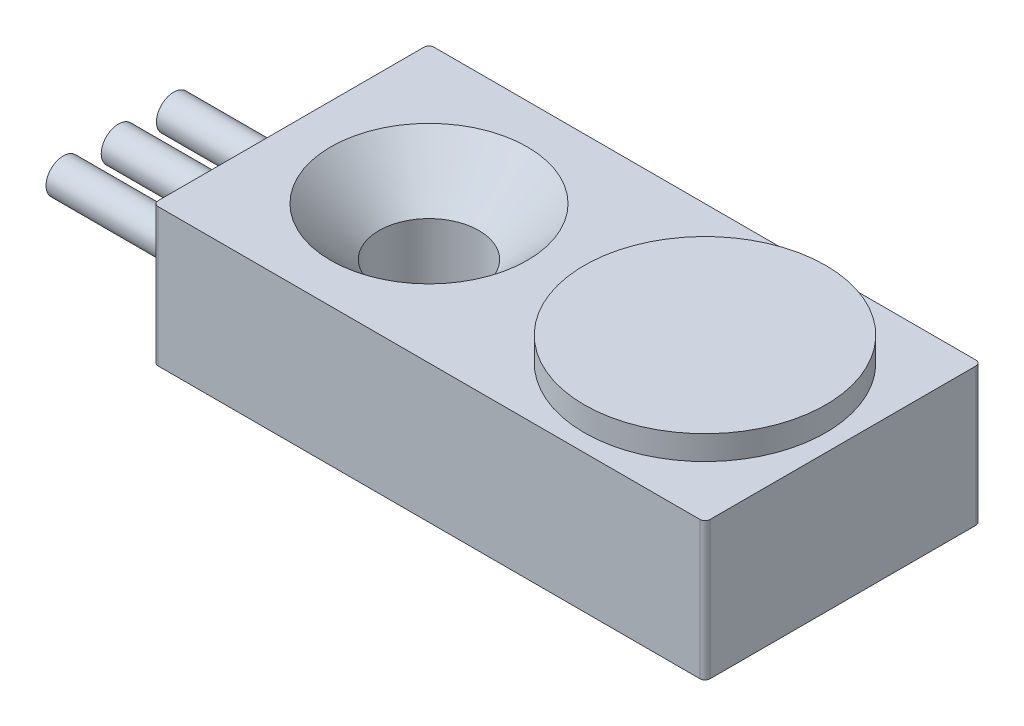
ISO-10303-21;
HEADER;
FILE_DESCRIPTION(('STEP AP214'),'2;1');
FILE_NAME('part.step','',(''),(''),'','','');
FILE_SCHEMA(('AUTOMOTIVE_DESIGN { 1 0 10303 214 1 1 1 1 }'));
ENDSEC;
DATA;
#1=APPLICATION_CONTEXT('core data for automotive mechanical design processes');
#2=APPLICATION_PROTOCOL_DEFINITION('international standard','automotive_design',2000,#1);
#3=PRODUCT_CONTEXT('',#1,'mechanical');
#4=PRODUCT('Part','Part','',(#3));
#5=PRODUCT_RELATED_PRODUCT_CATEGORY('part','',(#4));
#6=PRODUCT_DEFINITION_FORMATION('','',#4);
#7=PRODUCT_DEFINITION_CONTEXT('part definition',#1,'design');
#8=PRODUCT_DEFINITION('design','',#6,#7);
#9=PRODUCT_DEFINITION_SHAPE('','',#8);
#10=(LENGTH_UNIT() NAMED_UNIT(*) SI_UNIT(.MILLI.,.METRE.));
#11=(NAMED_UNIT(*) PLANE_ANGLE_UNIT() SI_UNIT($,.RADIAN.));
#12=(NAMED_UNIT(*) SI_UNIT($,.STERADIAN.) SOLID_ANGLE_UNIT());
#13=UNCERTAINTY_MEASURE_WITH_UNIT(LENGTH_MEASURE(1.E-05),#10,'distance_accuracy_value','');
#14=(GEOMETRIC_REPRESENTATION_CONTEXT(3) GLOBAL_UNCERTAINTY_ASSIGNED_CONTEXT((#13)) GLOBAL_UNIT_ASSIGNED_CONTEXT((#10,
#11,#12)) REPRESENTATION_CONTEXT('',''));
#15=CARTESIAN_POINT('',(0.,0.,0.));
#16=DIRECTION('',(0.,0.,1.));
#17=DIRECTION('',(1.,0.,0.));
#18=AXIS2_PLACEMENT_3D('',#15,#16,#17);
#19=CARTESIAN_POINT('',(0.,4.7,0.));
#20=DIRECTION('',(0.,1.,0.));
#21=DIRECTION('',(0.,0.,1.));
#22=AXIS2_PLACEMENT_3D('',#19,#20,#21);
#23=PLANE('',#22);
#24=CARTESIAN_POINT('',(0.,4.7,0.));
#25=DIRECTION('',(0.,1.,0.));
#26=DIRECTION('',(0.,0.,1.));
#27=AXIS2_PLACEMENT_3D('',#24,#25,#26);
#28=CIRCLE('',#27,3.5);
#29=CARTESIAN_POINT('',(0.,4.7,3.5));
#30=VERTEX_POINT('',#29);
#31=EDGE_CURVE('E18',#30,#30,#28,.F.);
#32=ORIENTED_EDGE('',*,*,#31,.F.);
#33=EDGE_LOOP('',(#32));
#34=FACE_BOUND('',#33,.T.);
#35=ADVANCED_FACE('F15',(#34),#23,.T.);
#36=CARTESIAN_POINT('',(-17.,0.,0.));
#37=DIRECTION('',(-1.,0.,0.));
#38=DIRECTION('',(0.,0.,1.));
#39=AXIS2_PLACEMENT_3D('',#36,#37,#38);
#40=PLANE('',#39);
#41=CARTESIAN_POINT('',(-17.,1.,0.));
#42=DIRECTION('',(-1.,0.,0.));
#43=DIRECTION('',(0.,0.,1.));
#44=AXIS2_PLACEMENT_3D('',#41,#42,#43);
#45=CIRCLE('',#44,0.5);
#46=CARTESIAN_POINT('',(-17.,1.,0.5));
#47=VERTEX_POINT('',#46);
#48=EDGE_CURVE('E157',#47,#47,#45,.F.);
#49=ORIENTED_EDGE('',*,*,#48,.F.);
#50=EDGE_LOOP('',(#49));
#51=FACE_BOUND('',#50,.T.);
#52=ADVANCED_FACE('F169',(#51),#40,.T.);
#53=CARTESIAN_POINT('',(-17.,0.,0.));
#54=DIRECTION('',(-1.,0.,0.));
#55=DIRECTION('',(0.,0.,1.));
#56=AXIS2_PLACEMENT_3D('',#53,#54,#55);
#57=PLANE('',#56);
#58=CARTESIAN_POINT('',(-17.,1.,1.6));
#59=DIRECTION('',(-1.,0.,0.));
#60=DIRECTION('',(0.,0.,1.));
#61=AXIS2_PLACEMENT_3D('',#58,#59,#60);
#62=CIRCLE('',#61,0.5);
#63=CARTESIAN_POINT('',(-17.,1.,2.1));
#64=VERTEX_POINT('',#63);
#65=EDGE_CURVE('E154',#64,#64,#62,.F.);
#66=ORIENTED_EDGE('',*,*,#65,.F.);
#67=EDGE_LOOP('',(#66));
#68=FACE_BOUND('',#67,.T.);
#69=ADVANCED_FACE('F174',(#68),#57,.T.);
#70=CARTESIAN_POINT('',(-17.,0.,0.));
#71=DIRECTION('',(-1.,0.,0.));
#72=DIRECTION('',(0.,0.,1.));
#73=AXIS2_PLACEMENT_3D('',#70,#71,#72);
#74=PLANE('',#73);
#75=CARTESIAN_POINT('',(-17.,1.,-1.6));
#76=DIRECTION('',(-1.,0.,0.));
#77=DIRECTION('',(0.,0.,1.));
#78=AXIS2_PLACEMENT_3D('',#75,#76,#77);
#79=CIRCLE('',#78,0.5);
#80=CARTESIAN_POINT('',(-17.,1.,-1.1));
#81=VERTEX_POINT('',#80);
#82=EDGE_CURVE('E151',#81,#81,#79,.F.);
#83=ORIENTED_EDGE('',*,*,#82,.F.);
#84=EDGE_LOOP('',(#83));
#85=FACE_BOUND('',#84,.T.);
#86=ADVANCED_FACE('F235',(#85),#74,.T.);
#87=CARTESIAN_POINT('',(0.,4.7,0.));
#88=DIRECTION('',(0.,1.,0.));
#89=DIRECTION('',(0.,0.,1.));
#90=AXIS2_PLACEMENT_3D('',#87,#88,#89);
#91=CYLINDRICAL_SURFACE('',#90,3.5);
#92=ORIENTED_EDGE('',*,*,#31,.T.);
#93=EDGE_LOOP('',(#92));
#94=FACE_BOUND('',#93,.T.);
#95=CARTESIAN_POINT('',(0.,4.,0.));
#96=DIRECTION('',(0.,1.,0.));
#97=DIRECTION('',(0.,0.,1.));
#98=AXIS2_PLACEMENT_3D('',#95,#96,#97);
#99=CIRCLE('',#98,3.5);
#100=CARTESIAN_POINT('',(0.,4.,3.5));
#101=VERTEX_POINT('',#100);
#102=EDGE_CURVE('E142',#101,#101,#99,.F.);
#103=ORIENTED_EDGE('',*,*,#102,.F.);
#104=EDGE_LOOP('',(#103));
#105=FACE_BOUND('',#104,.T.);
#106=ADVANCED_FACE('F165',(#94,#105),#91,.T.);
#107=CARTESIAN_POINT('',(-11.85,4.035923931014,-3.85));
#108=DIRECTION('',(0.,-1.,0.));
#109=DIRECTION('',(0.,0.,-1.));
#110=AXIS2_PLACEMENT_3D('',#107,#108,#109);
#111=CYLINDRICAL_SURFACE('',#110,0.15);
#112=DIRECTION('',(0.,1.,0.));
#113=VECTOR('',#112,1.);
#114=CARTESIAN_POINT('',(-11.85,0.,-4.));
#115=LINE('',#114,#113);
#116=CARTESIAN_POINT('',(-11.85,0.,-4.));
#117=VERTEX_POINT('',#116);
#118=CARTESIAN_POINT('',(-11.85,4.,-4.));
#119=VERTEX_POINT('',#118);
#120=EDGE_CURVE('E125',#117,#119,#115,.T.);
#121=ORIENTED_EDGE('',*,*,#120,.F.);
#122=CARTESIAN_POINT('',(-11.85,0.,-3.85));
#123=DIRECTION('',(0.,-1.,0.));
#124=DIRECTION('',(0.,0.,-1.));
#125=AXIS2_PLACEMENT_3D('',#122,#123,#124);
#126=CIRCLE('',#125,0.15);
#127=CARTESIAN_POINT('',(-12.,0.,-3.85));
#128=VERTEX_POINT('',#127);
#129=EDGE_CURVE('E71',#117,#128,#126,.F.);
#130=ORIENTED_EDGE('',*,*,#129,.T.);
#131=DIRECTION('',(0.,1.,0.));
#132=VECTOR('',#131,1.);
#133=CARTESIAN_POINT('',(-12.,0.,-3.85));
#134=LINE('',#133,#132);
#135=CARTESIAN_POINT('',(-12.,4.,-3.85));
#136=VERTEX_POINT('',#135);
#137=EDGE_CURVE('E122',#136,#128,#134,.F.);
#138=ORIENTED_EDGE('',*,*,#137,.F.);
#139=CARTESIAN_POINT('',(-11.85,4.,-3.85));
#140=DIRECTION('',(0.,-1.,0.));
#141=DIRECTION('',(0.,0.,-1.));
#142=AXIS2_PLACEMENT_3D('',#139,#140,#141);
#143=CIRCLE('',#142,0.15);
#144=EDGE_CURVE('E147',#119,#136,#143,.F.);
#145=ORIENTED_EDGE('',*,*,#144,.F.);
#146=EDGE_LOOP('',(#121,#130,#138,#145));
#147=FACE_BOUND('',#146,.T.);
#148=ADVANCED_FACE('F229',(#147),#111,.T.);
#149=CARTESIAN_POINT('',(-12.,1.,0.));
#150=DIRECTION('',(-1.,0.,0.));
#151=DIRECTION('',(0.,0.,1.));
#152=AXIS2_PLACEMENT_3D('',#149,#150,#151);
#153=CYLINDRICAL_SURFACE('',#152,0.5);
#154=ORIENTED_EDGE('',*,*,#48,.T.);
#155=EDGE_LOOP('',(#154));
#156=FACE_BOUND('',#155,.T.);
#157=CARTESIAN_POINT('',(-12.,1.,0.));
#158=DIRECTION('',(-1.,0.,0.));
#159=DIRECTION('',(0.,0.,1.));
#160=AXIS2_PLACEMENT_3D('',#157,#158,#159);
#161=CIRCLE('',#160,0.5);
#162=CARTESIAN_POINT('',(-12.,1.,0.5));
#163=VERTEX_POINT('',#162);
#164=EDGE_CURVE('E133',#163,#163,#161,.F.);
#165=ORIENTED_EDGE('',*,*,#164,.F.);
#166=EDGE_LOOP('',(#165));
#167=FACE_BOUND('',#166,.T.);
#168=ADVANCED_FACE('F225',(#156,#167),#153,.T.);
#169=CARTESIAN_POINT('',(-12.,1.,1.6));
#170=DIRECTION('',(-1.,0.,0.));
#171=DIRECTION('',(0.,0.,1.));
#172=AXIS2_PLACEMENT_3D('',#169,#170,#171);
#173=CYLINDRICAL_SURFACE('',#172,0.5);
#174=ORIENTED_EDGE('',*,*,#65,.T.);
#175=EDGE_LOOP('',(#174));
#176=FACE_BOUND('',#175,.T.);
#177=CARTESIAN_POINT('',(-12.,1.,1.6));
#178=DIRECTION('',(-1.,0.,0.));
#179=DIRECTION('',(0.,0.,1.));
#180=AXIS2_PLACEMENT_3D('',#177,#178,#179);
#181=CIRCLE('',#180,0.5);
#182=CARTESIAN_POINT('',(-12.,1.,2.1));
#183=VERTEX_POINT('',#182);
#184=EDGE_CURVE('E130',#183,#183,#181,.F.);
#185=ORIENTED_EDGE('',*,*,#184,.F.);
#186=EDGE_LOOP('',(#185));
#187=FACE_BOUND('',#186,.T.);
#188=ADVANCED_FACE('F221',(#176,#187),#173,.T.);
#189=CARTESIAN_POINT('',(-12.,1.,-1.6));
#190=DIRECTION('',(-1.,0.,0.));
#191=DIRECTION('',(0.,0.,1.));
#192=AXIS2_PLACEMENT_3D('',#189,#190,#191);
#193=CYLINDRICAL_SURFACE('',#192,0.5);
#194=ORIENTED_EDGE('',*,*,#82,.T.);
#195=EDGE_LOOP('',(#194));
#196=FACE_BOUND('',#195,.T.);
#197=CARTESIAN_POINT('',(-12.,1.,-1.6));
#198=DIRECTION('',(-1.,0.,0.));
#199=DIRECTION('',(0.,0.,1.));
#200=AXIS2_PLACEMENT_3D('',#197,#198,#199);
#201=CIRCLE('',#200,0.5);
#202=CARTESIAN_POINT('',(-12.,1.,-1.1));
#203=VERTEX_POINT('',#202);
#204=EDGE_CURVE('E127',#203,#203,#201,.F.);
#205=ORIENTED_EDGE('',*,*,#204,.F.);
#206=EDGE_LOOP('',(#205));
#207=FACE_BOUND('',#206,.T.);
#208=ADVANCED_FACE('F217',(#196,#207),#193,.T.);
#209=CARTESIAN_POINT('',(-11.85,4.035923931014,3.85));
#210=DIRECTION('',(0.,-1.,0.));
#211=DIRECTION('',(0.,0.,-1.));
#212=AXIS2_PLACEMENT_3D('',#209,#210,#211);
#213=CYLINDRICAL_SURFACE('',#212,0.15);
#214=DIRECTION('',(0.,1.,0.));
#215=VECTOR('',#214,1.);
#216=CARTESIAN_POINT('',(-12.,0.,3.85));
#217=LINE('',#216,#215);
#218=CARTESIAN_POINT('',(-12.,0.,3.85));
#219=VERTEX_POINT('',#218);
#220=CARTESIAN_POINT('',(-12.,4.,3.85));
#221=VERTEX_POINT('',#220);
#222=EDGE_CURVE('E123',#219,#221,#217,.T.);
#223=ORIENTED_EDGE('',*,*,#222,.F.);
#224=CARTESIAN_POINT('',(-11.85,0.,3.85));
#225=DIRECTION('',(0.,-1.,0.));
#226=DIRECTION('',(0.,0.,-1.));
#227=AXIS2_PLACEMENT_3D('',#224,#225,#226);
#228=CIRCLE('',#227,0.15);
#229=CARTESIAN_POINT('',(-11.85,0.,4.));
#230=VERTEX_POINT('',#229);
#231=EDGE_CURVE('E149',#219,#230,#228,.F.);
#232=ORIENTED_EDGE('',*,*,#231,.T.);
#233=DIRECTION('',(0.,1.,0.));
#234=VECTOR('',#233,1.);
#235=CARTESIAN_POINT('',(-11.85,0.,4.));
#236=LINE('',#235,#234);
#237=CARTESIAN_POINT('',(-11.85,4.,4.));
#238=VERTEX_POINT('',#237);
#239=EDGE_CURVE('E107',#238,#230,#236,.F.);
#240=ORIENTED_EDGE('',*,*,#239,.F.);
#241=CARTESIAN_POINT('',(-11.85,4.,3.85));
#242=DIRECTION('',(0.,-1.,0.));
#243=DIRECTION('',(0.,0.,-1.));
#244=AXIS2_PLACEMENT_3D('',#241,#242,#243);
#245=CIRCLE('',#244,0.15);
#246=EDGE_CURVE('E145',#221,#238,#245,.F.);
#247=ORIENTED_EDGE('',*,*,#246,.F.);
#248=EDGE_LOOP('',(#223,#232,#240,#247));
#249=FACE_BOUND('',#248,.T.);
#250=ADVANCED_FACE('F213',(#249),#213,.T.);
#251=CARTESIAN_POINT('',(0.,4.,0.));
#252=DIRECTION('',(0.,1.,0.));
#253=DIRECTION('',(0.,0.,1.));
#254=AXIS2_PLACEMENT_3D('',#251,#252,#253);
#255=PLANE('',#254);
#256=CARTESIAN_POINT('',(-8.,4.0000000000191,0.));
#257=DIRECTION('',(0.,1.,0.));
#258=DIRECTION('',(0.,0.,1.));
#259=AXIS2_PLACEMENT_3D('',#256,#257,#258);
#260=CIRCLE('',#259,2.8500000000422);
#261=CARTESIAN_POINT('',(-8.,4.0000000000191,2.8500000000422));
#262=VERTEX_POINT('',#261);
#263=EDGE_CURVE('E136',#262,#262,#260,.F.);
#264=ORIENTED_EDGE('',*,*,#263,.T.);
#265=EDGE_LOOP('',(#264));
#266=FACE_BOUND('',#265,.T.);
#267=ORIENTED_EDGE('',*,*,#102,.T.);
#268=EDGE_LOOP('',(#267));
#269=FACE_BOUND('',#268,.T.);
#270=DIRECTION('',(0.,0.,-1.));
#271=VECTOR('',#270,1.);
#272=CARTESIAN_POINT('',(4.,4.,4.));
#273=LINE('',#272,#271);
#274=CARTESIAN_POINT('',(4.,4.,-3.85));
#275=VERTEX_POINT('',#274);
#276=CARTESIAN_POINT('',(4.,4.,3.85));
#277=VERTEX_POINT('',#276);
#278=EDGE_CURVE('E98',#275,#277,#273,.F.);
#279=ORIENTED_EDGE('',*,*,#278,.F.);
#280=CARTESIAN_POINT('',(3.85,4.,-3.85));
#281=DIRECTION('',(0.,-1.,0.));
#282=DIRECTION('',(0.,0.,-1.));
#283=AXIS2_PLACEMENT_3D('',#280,#281,#282);
#284=CIRCLE('',#283,0.15);
#285=CARTESIAN_POINT('',(3.85,4.,-4.));
#286=VERTEX_POINT('',#285);
#287=EDGE_CURVE('E86',#286,#275,#284,.T.);
#288=ORIENTED_EDGE('',*,*,#287,.F.);
#289=DIRECTION('',(-1.,0.,0.));
#290=VECTOR('',#289,1.);
#291=CARTESIAN_POINT('',(4.,4.,-4.));
#292=LINE('',#291,#290);
#293=EDGE_CURVE('E124',#119,#286,#292,.F.);
#294=ORIENTED_EDGE('',*,*,#293,.F.);
#295=ORIENTED_EDGE('',*,*,#144,.T.);
#296=DIRECTION('',(0.,0.,1.));
#297=VECTOR('',#296,1.);
#298=CARTESIAN_POINT('',(-12.,4.,-4.));
#299=LINE('',#298,#297);
#300=EDGE_CURVE('E119',#221,#136,#299,.F.);
#301=ORIENTED_EDGE('',*,*,#300,.F.);
#302=ORIENTED_EDGE('',*,*,#246,.T.);
#303=DIRECTION('',(1.,0.,0.));
#304=VECTOR('',#303,1.);
#305=CARTESIAN_POINT('',(-12.,4.,4.));
#306=LINE('',#305,#304);
#307=CARTESIAN_POINT('',(3.85,4.,4.));
#308=VERTEX_POINT('',#307);
#309=EDGE_CURVE('E111',#308,#238,#306,.F.);
#310=ORIENTED_EDGE('',*,*,#309,.F.);
#311=CARTESIAN_POINT('',(3.85,4.,3.85));
#312=DIRECTION('',(0.,-1.,0.));
#313=DIRECTION('',(0.,0.,-1.));
#314=AXIS2_PLACEMENT_3D('',#311,#312,#313);
#315=CIRCLE('',#314,0.15);
#316=EDGE_CURVE('E106',#277,#308,#315,.T.);
#317=ORIENTED_EDGE('',*,*,#316,.F.);
#318=EDGE_LOOP('',(#279,#288,#294,#295,#301,#302,#310,#317));
#319=FACE_BOUND('',#318,.T.);
#320=ADVANCED_FACE('F104',(#266,#269,#319),#255,.T.);
#321=CARTESIAN_POINT('',(3.85,4.035923931014,3.85));
#322=DIRECTION('',(0.,-1.,0.));
#323=DIRECTION('',(0.,0.,-1.));
#324=AXIS2_PLACEMENT_3D('',#321,#322,#323);
#325=CYLINDRICAL_SURFACE('',#324,0.15);
#326=DIRECTION('',(0.,1.,0.));
#327=VECTOR('',#326,1.);
#328=CARTESIAN_POINT('',(3.85,0.,4.));
#329=LINE('',#328,#327);
#330=CARTESIAN_POINT('',(3.85,0.,4.));
#331=VERTEX_POINT('',#330);
#332=EDGE_CURVE('E118',#331,#308,#329,.T.);
#333=ORIENTED_EDGE('',*,*,#332,.F.);
#334=CARTESIAN_POINT('',(3.85,0.,3.85));
#335=DIRECTION('',(0.,-1.,0.));
#336=DIRECTION('',(0.,0.,-1.));
#337=AXIS2_PLACEMENT_3D('',#334,#335,#336);
#338=CIRCLE('',#337,0.15);
#339=CARTESIAN_POINT('',(4.,0.,3.85));
#340=VERTEX_POINT('',#339);
#341=EDGE_CURVE('E33',#331,#340,#338,.F.);
#342=ORIENTED_EDGE('',*,*,#341,.T.);
#343=DIRECTION('',(0.,1.,0.));
#344=VECTOR('',#343,1.);
#345=CARTESIAN_POINT('',(4.,0.,3.85));
#346=LINE('',#345,#344);
#347=EDGE_CURVE('E102',#277,#340,#346,.F.);
#348=ORIENTED_EDGE('',*,*,#347,.F.);
#349=ORIENTED_EDGE('',*,*,#316,.T.);
#350=EDGE_LOOP('',(#333,#342,#348,#349));
#351=FACE_BOUND('',#350,.T.);
#352=ADVANCED_FACE('F208',(#351),#325,.T.);
#353=CARTESIAN_POINT('',(3.85,4.035923931014,-3.85));
#354=DIRECTION('',(0.,-1.,0.));
#355=DIRECTION('',(0.,0.,-1.));
#356=AXIS2_PLACEMENT_3D('',#353,#354,#355);
#357=CYLINDRICAL_SURFACE('',#356,0.15);
#358=DIRECTION('',(0.,1.,0.));
#359=VECTOR('',#358,1.);
#360=CARTESIAN_POINT('',(4.,0.,-3.85));
#361=LINE('',#360,#359);
#362=CARTESIAN_POINT('',(4.,0.,-3.85));
#363=VERTEX_POINT('',#362);
#364=EDGE_CURVE('E89',#363,#275,#361,.T.);
#365=ORIENTED_EDGE('',*,*,#364,.F.);
#366=CARTESIAN_POINT('',(3.85,0.,-3.85));
#367=DIRECTION('',(0.,-1.,0.));
#368=DIRECTION('',(0.,0.,-1.));
#369=AXIS2_PLACEMENT_3D('',#366,#367,#368);
#370=CIRCLE('',#369,0.15);
#371=CARTESIAN_POINT('',(3.85,0.,-4.));
#372=VERTEX_POINT('',#371);
#373=EDGE_CURVE('E79',#363,#372,#370,.F.);
#374=ORIENTED_EDGE('',*,*,#373,.T.);
#375=DIRECTION('',(0.,1.,0.));
#376=VECTOR('',#375,1.);
#377=CARTESIAN_POINT('',(3.85,0.,-4.));
#378=LINE('',#377,#376);
#379=EDGE_CURVE('E91',#286,#372,#378,.F.);
#380=ORIENTED_EDGE('',*,*,#379,.F.);
#381=ORIENTED_EDGE('',*,*,#287,.T.);
#382=EDGE_LOOP('',(#365,#374,#380,#381));
#383=FACE_BOUND('',#382,.T.);
#384=ADVANCED_FACE('F88',(#383),#357,.T.);
#385=CARTESIAN_POINT('',(-8.,4.0000000000191,0.));
#386=DIRECTION('',(0.,1.,0.));
#387=DIRECTION('',(0.,0.,1.));
#388=AXIS2_PLACEMENT_3D('',#385,#386,#387);
#389=CONICAL_SURFACE('',#388,2.8500000000422,0.785398163397448);
#390=CARTESIAN_POINT('',(-8.,2.6,0.));
#391=DIRECTION('',(0.,-1.,0.));
#392=DIRECTION('',(0.,0.,-1.));
#393=AXIS2_PLACEMENT_3D('',#390,#391,#392);
#394=CIRCLE('',#393,1.45);
#395=CARTESIAN_POINT('',(-8.,2.6,-1.45));
#396=VERTEX_POINT('',#395);
#397=EDGE_CURVE('E101',#396,#396,#394,.T.);
#398=ORIENTED_EDGE('',*,*,#397,.T.);
#399=EDGE_LOOP('',(#398));
#400=FACE_BOUND('',#399,.T.);
#401=ORIENTED_EDGE('',*,*,#263,.F.);
#402=EDGE_LOOP('',(#401));
#403=FACE_BOUND('',#402,.T.);
#404=ADVANCED_FACE('F201',(#400,#403),#389,.F.);
#405=CARTESIAN_POINT('',(4.,0.,-4.));
#406=DIRECTION('',(0.,0.,-1.));
#407=DIRECTION('',(-1.,0.,0.));
#408=AXIS2_PLACEMENT_3D('',#405,#406,#407);
#409=PLANE('',#408);
#410=ORIENTED_EDGE('',*,*,#293,.T.);
#411=ORIENTED_EDGE('',*,*,#379,.T.);
#412=DIRECTION('',(1.,0.,0.));
#413=VECTOR('',#412,1.);
#414=CARTESIAN_POINT('',(0.,0.,-4.));
#415=LINE('',#414,#413);
#416=EDGE_CURVE('E260',#372,#117,#415,.F.);
#417=ORIENTED_EDGE('',*,*,#416,.T.);
#418=ORIENTED_EDGE('',*,*,#120,.T.);
#419=EDGE_LOOP('',(#410,#411,#417,#418));
#420=FACE_BOUND('',#419,.T.);
#421=ADVANCED_FACE('F197',(#420),#409,.T.);
#422=CARTESIAN_POINT('',(-12.,0.,-4.));
#423=DIRECTION('',(-1.,0.,0.));
#424=DIRECTION('',(0.,0.,1.));
#425=AXIS2_PLACEMENT_3D('',#422,#423,#424);
#426=PLANE('',#425);
#427=ORIENTED_EDGE('',*,*,#204,.T.);
#428=EDGE_LOOP('',(#427));
#429=FACE_BOUND('',#428,.T.);
#430=ORIENTED_EDGE('',*,*,#184,.T.);
#431=EDGE_LOOP('',(#430));
#432=FACE_BOUND('',#431,.T.);
#433=ORIENTED_EDGE('',*,*,#164,.T.);
#434=EDGE_LOOP('',(#433));
#435=FACE_BOUND('',#434,.T.);
#436=ORIENTED_EDGE('',*,*,#300,.T.);
#437=ORIENTED_EDGE('',*,*,#137,.T.);
#438=DIRECTION('',(0.,0.,1.));
#439=VECTOR('',#438,1.);
#440=CARTESIAN_POINT('',(-12.,0.,0.));
#441=LINE('',#440,#439);
#442=EDGE_CURVE('E261',#128,#219,#441,.T.);
#443=ORIENTED_EDGE('',*,*,#442,.T.);
#444=ORIENTED_EDGE('',*,*,#222,.T.);
#445=EDGE_LOOP('',(#436,#437,#443,#444));
#446=FACE_BOUND('',#445,.T.);
#447=ADVANCED_FACE('F193',(#429,#432,#435,#446),#426,.T.);
#448=CARTESIAN_POINT('',(-12.,0.,4.));
#449=DIRECTION('',(0.,0.,1.));
#450=DIRECTION('',(1.,0.,0.));
#451=AXIS2_PLACEMENT_3D('',#448,#449,#450);
#452=PLANE('',#451);
#453=ORIENTED_EDGE('',*,*,#309,.T.);
#454=ORIENTED_EDGE('',*,*,#239,.T.);
#455=DIRECTION('',(1.,0.,0.));
#456=VECTOR('',#455,1.);
#457=CARTESIAN_POINT('',(0.,0.,4.));
#458=LINE('',#457,#456);
#459=EDGE_CURVE('E263',#230,#331,#458,.T.);
#460=ORIENTED_EDGE('',*,*,#459,.T.);
#461=ORIENTED_EDGE('',*,*,#332,.T.);
#462=EDGE_LOOP('',(#453,#454,#460,#461));
#463=FACE_BOUND('',#462,.T.);
#464=ADVANCED_FACE('F190',(#463),#452,.T.);
#465=CARTESIAN_POINT('',(4.,0.,4.));
#466=DIRECTION('',(1.,0.,0.));
#467=DIRECTION('',(0.,0.,-1.));
#468=AXIS2_PLACEMENT_3D('',#465,#466,#467);
#469=PLANE('',#468);
#470=DIRECTION('',(0.,0.,1.));
#471=VECTOR('',#470,1.);
#472=CARTESIAN_POINT('',(4.,0.,0.));
#473=LINE('',#472,#471);
#474=EDGE_CURVE('E24',#340,#363,#473,.F.);
#475=ORIENTED_EDGE('',*,*,#474,.T.);
#476=ORIENTED_EDGE('',*,*,#364,.T.);
#477=ORIENTED_EDGE('',*,*,#278,.T.);
#478=ORIENTED_EDGE('',*,*,#347,.T.);
#479=EDGE_LOOP('',(#475,#476,#477,#478));
#480=FACE_BOUND('',#479,.T.);
#481=ADVANCED_FACE('F97',(#480),#469,.T.);
#482=CARTESIAN_POINT('',(-8.,4.2,0.));
#483=DIRECTION('',(0.,-1.,0.));
#484=DIRECTION('',(0.,0.,-1.));
#485=AXIS2_PLACEMENT_3D('',#482,#483,#484);
#486=CYLINDRICAL_SURFACE('',#485,1.45);
#487=ORIENTED_EDGE('',*,*,#397,.F.);
#488=EDGE_LOOP('',(#487));
#489=FACE_BOUND('',#488,.T.);
#490=CARTESIAN_POINT('',(-8.,0.,0.));
#491=DIRECTION('',(0.,-1.,0.));
#492=DIRECTION('',(0.,0.,-1.));
#493=AXIS2_PLACEMENT_3D('',#490,#491,#492);
#494=CIRCLE('',#493,1.45);
#495=CARTESIAN_POINT('',(-8.,0.,-1.45));
#496=VERTEX_POINT('',#495);
#497=EDGE_CURVE('E10',#496,#496,#494,.T.);
#498=ORIENTED_EDGE('',*,*,#497,.T.);
#499=EDGE_LOOP('',(#498));
#500=FACE_BOUND('',#499,.T.);
#501=ADVANCED_FACE('F178',(#489,#500),#486,.F.);
#502=CARTESIAN_POINT('',(0.,0.,0.));
#503=DIRECTION('',(0.,1.,0.));
#504=DIRECTION('',(0.,0.,1.));
#505=AXIS2_PLACEMENT_3D('',#502,#503,#504);
#506=PLANE('',#505);
#507=ORIENTED_EDGE('',*,*,#497,.F.);
#508=EDGE_LOOP('',(#507));
#509=FACE_BOUND('',#508,.T.);
#510=ORIENTED_EDGE('',*,*,#341,.F.);
#511=ORIENTED_EDGE('',*,*,#459,.F.);
#512=ORIENTED_EDGE('',*,*,#231,.F.);
#513=ORIENTED_EDGE('',*,*,#442,.F.);
#514=ORIENTED_EDGE('',*,*,#129,.F.);
#515=ORIENTED_EDGE('',*,*,#416,.F.);
#516=ORIENTED_EDGE('',*,*,#373,.F.);
#517=ORIENTED_EDGE('',*,*,#474,.F.);
#518=EDGE_LOOP('',(#510,#511,#512,#513,#514,#515,#516,#517));
#519=FACE_BOUND('',#518,.T.);
#520=ADVANCED_FACE('F176',(#509,#519),#506,.F.);
#521=CLOSED_SHELL('',(#35,#52,#69,#86,#106,#148,#168,#188,#208,#250,#320,#352,#384,#404,#421,
#447,#464,#481,#501,#520));
#522=MANIFOLD_SOLID_BREP('B1',#521);
#523=ADVANCED_BREP_SHAPE_REPRESENTATION('',(#18,#522),#14);
#524=SHAPE_DEFINITION_REPRESENTATION(#9,#523);
ENDSEC;
END-ISO-10303-21;
